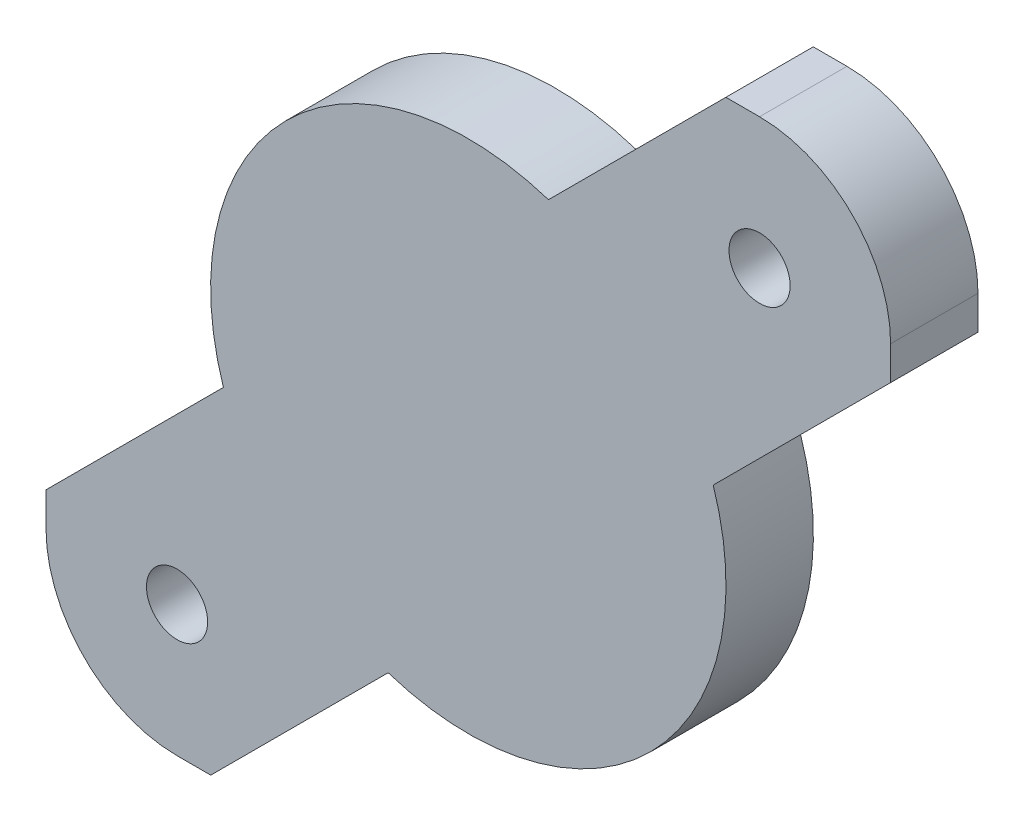
ISO-10303-21;
HEADER;
FILE_DESCRIPTION(('STEP AP214'),'2;1');
FILE_NAME('part.step','',(''),(''),'','','');
FILE_SCHEMA(('AUTOMOTIVE_DESIGN { 1 0 10303 214 1 1 1 1 }'));
ENDSEC;
DATA;
#1=APPLICATION_CONTEXT('core data for automotive mechanical design processes');
#2=APPLICATION_PROTOCOL_DEFINITION('international standard','automotive_design',2000,#1);
#3=PRODUCT_CONTEXT('',#1,'mechanical');
#4=PRODUCT('Part','Part','',(#3));
#5=PRODUCT_RELATED_PRODUCT_CATEGORY('part','',(#4));
#6=PRODUCT_DEFINITION_FORMATION('','',#4);
#7=PRODUCT_DEFINITION_CONTEXT('part definition',#1,'design');
#8=PRODUCT_DEFINITION('design','',#6,#7);
#9=PRODUCT_DEFINITION_SHAPE('','',#8);
#10=(LENGTH_UNIT() NAMED_UNIT(*) SI_UNIT(.MILLI.,.METRE.));
#11=(NAMED_UNIT(*) PLANE_ANGLE_UNIT() SI_UNIT($,.RADIAN.));
#12=(NAMED_UNIT(*) SI_UNIT($,.STERADIAN.) SOLID_ANGLE_UNIT());
#13=UNCERTAINTY_MEASURE_WITH_UNIT(LENGTH_MEASURE(1.E-05),#10,'distance_accuracy_value','');
#14=(GEOMETRIC_REPRESENTATION_CONTEXT(3) GLOBAL_UNCERTAINTY_ASSIGNED_CONTEXT((#13)) GLOBAL_UNIT_ASSIGNED_CONTEXT((#10,
#11,#12)) REPRESENTATION_CONTEXT('',''));
#15=CARTESIAN_POINT('',(0.,0.,0.));
#16=DIRECTION('',(0.,0.,1.));
#17=DIRECTION('',(1.,0.,0.));
#18=AXIS2_PLACEMENT_3D('',#15,#16,#17);
#19=CARTESIAN_POINT('',(0.,0.,3.));
#20=DIRECTION('',(0.,0.,1.));
#21=DIRECTION('',(1.,0.,0.));
#22=AXIS2_PLACEMENT_3D('',#19,#20,#21);
#23=PLANE('',#22);
#24=CARTESIAN_POINT('',(10.,10.,3.));
#25=DIRECTION('',(0.,0.,1.));
#26=DIRECTION('',(1.,0.,0.));
#27=AXIS2_PLACEMENT_3D('',#24,#25,#26);
#28=CIRCLE('',#27,1.05);
#29=CARTESIAN_POINT('',(11.05,10.,3.));
#30=VERTEX_POINT('',#29);
#31=EDGE_CURVE('E158',#30,#30,#28,.T.);
#32=ORIENTED_EDGE('',*,*,#31,.F.);
#33=EDGE_LOOP('',(#32));
#34=FACE_BOUND('',#33,.T.);
#35=CARTESIAN_POINT('',(0.,0.,3.));
#36=DIRECTION('',(0.,0.,1.));
#37=DIRECTION('',(1.,0.,0.));
#38=AXIS2_PLACEMENT_3D('',#35,#36,#37);
#39=CIRCLE('',#38,8.84830328308138);
#40=CARTESIAN_POINT('',(2.7524541223952,8.40930837188757,3.));
#41=VERTEX_POINT('',#40);
#42=CARTESIAN_POINT('',(-8.40930837188758,-2.75245412239519,3.));
#43=VERTEX_POINT('',#42);
#44=EDGE_CURVE('E177',#41,#43,#39,.T.);
#45=ORIENTED_EDGE('',*,*,#44,.T.);
#46=DIRECTION('',(-0.707106781186541,-0.707106781186554,0.));
#47=VECTOR('',#46,1.);
#48=CARTESIAN_POINT('',(-8.40930837188758,-2.75245412239519,3.));
#49=LINE('',#48,#47);
#50=CARTESIAN_POINT('',(-14.5,-8.84314575050771,3.));
#51=VERTEX_POINT('',#50);
#52=EDGE_CURVE('E105',#43,#51,#49,.T.);
#53=ORIENTED_EDGE('',*,*,#52,.T.);
#54=DIRECTION('',(0.,-1.,0.));
#55=VECTOR('',#54,1.);
#56=CARTESIAN_POINT('',(-14.5,-10.,3.));
#57=LINE('',#56,#55);
#58=CARTESIAN_POINT('',(-14.5,-10.,3.));
#59=VERTEX_POINT('',#58);
#60=EDGE_CURVE('E204',#51,#59,#57,.T.);
#61=ORIENTED_EDGE('',*,*,#60,.T.);
#62=CARTESIAN_POINT('',(-9.99999999999999,-10.,3.));
#63=DIRECTION('',(0.,0.,1.));
#64=DIRECTION('',(1.,0.,0.));
#65=AXIS2_PLACEMENT_3D('',#62,#63,#64);
#66=CIRCLE('',#65,4.5);
#67=CARTESIAN_POINT('',(-9.99999999999999,-14.5,3.));
#68=VERTEX_POINT('',#67);
#69=EDGE_CURVE('E223',#59,#68,#66,.T.);
#70=ORIENTED_EDGE('',*,*,#69,.T.);
#71=DIRECTION('',(1.,0.,0.));
#72=VECTOR('',#71,1.);
#73=CARTESIAN_POINT('',(-9.99999999999999,-14.5,3.));
#74=LINE('',#73,#72);
#75=CARTESIAN_POINT('',(-8.84314575050751,-14.5,3.));
#76=VERTEX_POINT('',#75);
#77=EDGE_CURVE('E220',#68,#76,#74,.T.);
#78=ORIENTED_EDGE('',*,*,#77,.T.);
#79=DIRECTION('',(0.707106781186541,0.707106781186554,0.));
#80=VECTOR('',#79,1.);
#81=CARTESIAN_POINT('',(-2.75245412239519,-8.40930837188757,3.));
#82=LINE('',#81,#80);
#83=CARTESIAN_POINT('',(-2.75245412239519,-8.40930837188757,3.));
#84=VERTEX_POINT('',#83);
#85=EDGE_CURVE('E222',#76,#84,#82,.T.);
#86=ORIENTED_EDGE('',*,*,#85,.T.);
#87=CARTESIAN_POINT('',(0.,0.,3.));
#88=DIRECTION('',(0.,0.,1.));
#89=DIRECTION('',(1.,0.,0.));
#90=AXIS2_PLACEMENT_3D('',#87,#88,#89);
#91=CIRCLE('',#90,8.84830328308138);
#92=CARTESIAN_POINT('',(8.40930837188758,2.75245412239519,3.));
#93=VERTEX_POINT('',#92);
#94=EDGE_CURVE('E225',#84,#93,#91,.T.);
#95=ORIENTED_EDGE('',*,*,#94,.T.);
#96=DIRECTION('',(0.707106781186546,0.707106781186549,0.));
#97=VECTOR('',#96,1.);
#98=CARTESIAN_POINT('',(8.40930837188758,2.75245412239519,3.));
#99=LINE('',#98,#97);
#100=CARTESIAN_POINT('',(14.5,8.84314575050764,3.));
#101=VERTEX_POINT('',#100);
#102=EDGE_CURVE('E231',#93,#101,#99,.T.);
#103=ORIENTED_EDGE('',*,*,#102,.T.);
#104=DIRECTION('',(0.,1.,0.));
#105=VECTOR('',#104,1.);
#106=CARTESIAN_POINT('',(14.5,10.,3.));
#107=LINE('',#106,#105);
#108=CARTESIAN_POINT('',(14.5,10.,3.));
#109=VERTEX_POINT('',#108);
#110=EDGE_CURVE('E136',#101,#109,#107,.T.);
#111=ORIENTED_EDGE('',*,*,#110,.T.);
#112=CARTESIAN_POINT('',(10.,10.,3.));
#113=DIRECTION('',(0.,0.,1.));
#114=DIRECTION('',(1.,0.,0.));
#115=AXIS2_PLACEMENT_3D('',#112,#113,#114);
#116=CIRCLE('',#115,4.5);
#117=CARTESIAN_POINT('',(10.,14.5,3.));
#118=VERTEX_POINT('',#117);
#119=EDGE_CURVE('E130',#109,#118,#116,.T.);
#120=ORIENTED_EDGE('',*,*,#119,.T.);
#121=DIRECTION('',(-1.,0.,0.));
#122=VECTOR('',#121,1.);
#123=CARTESIAN_POINT('',(8.84314575050761,14.5,3.));
#124=LINE('',#123,#122);
#125=CARTESIAN_POINT('',(8.84314575050761,14.5,3.));
#126=VERTEX_POINT('',#125);
#127=EDGE_CURVE('E134',#118,#126,#124,.T.);
#128=ORIENTED_EDGE('',*,*,#127,.T.);
#129=DIRECTION('',(-0.707106781186546,-0.707106781186549,0.));
#130=VECTOR('',#129,1.);
#131=CARTESIAN_POINT('',(2.7524541223952,8.40930837188757,3.));
#132=LINE('',#131,#130);
#133=EDGE_CURVE('E50',#126,#41,#132,.T.);
#134=ORIENTED_EDGE('',*,*,#133,.T.);
#135=EDGE_LOOP('',(#45,#53,#61,#70,#78,#86,#95,#103,#111,#120,#128,#134));
#136=FACE_BOUND('',#135,.T.);
#137=CARTESIAN_POINT('',(-10.,-10.,3.));
#138=DIRECTION('',(0.,0.,1.));
#139=DIRECTION('',(1.,0.,0.));
#140=AXIS2_PLACEMENT_3D('',#137,#138,#139);
#141=CIRCLE('',#140,1.05);
#142=CARTESIAN_POINT('',(-8.95,-10.,3.));
#143=VERTEX_POINT('',#142);
#144=EDGE_CURVE('E273',#143,#143,#141,.T.);
#145=ORIENTED_EDGE('',*,*,#144,.F.);
#146=EDGE_LOOP('',(#145));
#147=FACE_BOUND('',#146,.T.);
#148=ADVANCED_FACE('F33',(#34,#136,#147),#23,.T.);
#149=CARTESIAN_POINT('',(0.,0.,0.));
#150=DIRECTION('',(0.,0.,1.));
#151=DIRECTION('',(1.,0.,0.));
#152=AXIS2_PLACEMENT_3D('',#149,#150,#151);
#153=PLANE('',#152);
#154=CARTESIAN_POINT('',(0.,0.,0.));
#155=DIRECTION('',(0.,0.,1.));
#156=DIRECTION('',(1.,0.,0.));
#157=AXIS2_PLACEMENT_3D('',#154,#155,#156);
#158=CIRCLE('',#157,8.84830328308138);
#159=CARTESIAN_POINT('',(2.7524541223952,8.40930837188757,0.));
#160=VERTEX_POINT('',#159);
#161=CARTESIAN_POINT('',(-8.40930837188758,-2.75245412239519,0.));
#162=VERTEX_POINT('',#161);
#163=EDGE_CURVE('E154',#160,#162,#158,.T.);
#164=ORIENTED_EDGE('',*,*,#163,.F.);
#165=DIRECTION('',(-0.707106781186546,-0.707106781186549,0.));
#166=VECTOR('',#165,1.);
#167=CARTESIAN_POINT('',(2.7524541223952,8.40930837188757,0.));
#168=LINE('',#167,#166);
#169=CARTESIAN_POINT('',(8.84314575050761,14.5,0.));
#170=VERTEX_POINT('',#169);
#171=EDGE_CURVE('E97',#170,#160,#168,.T.);
#172=ORIENTED_EDGE('',*,*,#171,.F.);
#173=DIRECTION('',(-1.,0.,0.));
#174=VECTOR('',#173,1.);
#175=CARTESIAN_POINT('',(8.84314575050761,14.5,0.));
#176=LINE('',#175,#174);
#177=CARTESIAN_POINT('',(10.,14.5,0.));
#178=VERTEX_POINT('',#177);
#179=EDGE_CURVE('E91',#178,#170,#176,.T.);
#180=ORIENTED_EDGE('',*,*,#179,.F.);
#181=CARTESIAN_POINT('',(10.,10.,0.));
#182=DIRECTION('',(0.,0.,1.));
#183=DIRECTION('',(1.,0.,0.));
#184=AXIS2_PLACEMENT_3D('',#181,#182,#183);
#185=CIRCLE('',#184,4.5);
#186=CARTESIAN_POINT('',(14.5,10.,0.));
#187=VERTEX_POINT('',#186);
#188=EDGE_CURVE('E144',#187,#178,#185,.T.);
#189=ORIENTED_EDGE('',*,*,#188,.F.);
#190=DIRECTION('',(0.,1.,0.));
#191=VECTOR('',#190,1.);
#192=CARTESIAN_POINT('',(14.5,10.,0.));
#193=LINE('',#192,#191);
#194=CARTESIAN_POINT('',(14.5,8.84314575050764,0.));
#195=VERTEX_POINT('',#194);
#196=EDGE_CURVE('E172',#195,#187,#193,.T.);
#197=ORIENTED_EDGE('',*,*,#196,.F.);
#198=DIRECTION('',(0.707106781186546,0.707106781186549,0.));
#199=VECTOR('',#198,1.);
#200=CARTESIAN_POINT('',(8.40930837188758,2.75245412239519,0.));
#201=LINE('',#200,#199);
#202=CARTESIAN_POINT('',(8.40930837188758,2.75245412239519,0.));
#203=VERTEX_POINT('',#202);
#204=EDGE_CURVE('E170',#203,#195,#201,.T.);
#205=ORIENTED_EDGE('',*,*,#204,.F.);
#206=CARTESIAN_POINT('',(0.,0.,0.));
#207=DIRECTION('',(0.,0.,1.));
#208=DIRECTION('',(1.,0.,0.));
#209=AXIS2_PLACEMENT_3D('',#206,#207,#208);
#210=CIRCLE('',#209,8.84830328308138);
#211=CARTESIAN_POINT('',(-2.75245412239519,-8.40930837188757,0.));
#212=VERTEX_POINT('',#211);
#213=EDGE_CURVE('E168',#212,#203,#210,.T.);
#214=ORIENTED_EDGE('',*,*,#213,.F.);
#215=DIRECTION('',(0.707106781186541,0.707106781186554,0.));
#216=VECTOR('',#215,1.);
#217=CARTESIAN_POINT('',(-2.75245412239519,-8.40930837188757,0.));
#218=LINE('',#217,#216);
#219=CARTESIAN_POINT('',(-8.84314575050751,-14.5,0.));
#220=VERTEX_POINT('',#219);
#221=EDGE_CURVE('E166',#220,#212,#218,.T.);
#222=ORIENTED_EDGE('',*,*,#221,.F.);
#223=DIRECTION('',(1.,0.,0.));
#224=VECTOR('',#223,1.);
#225=CARTESIAN_POINT('',(-9.99999999999999,-14.5,0.));
#226=LINE('',#225,#224);
#227=CARTESIAN_POINT('',(-9.99999999999999,-14.5,0.));
#228=VERTEX_POINT('',#227);
#229=EDGE_CURVE('E164',#228,#220,#226,.T.);
#230=ORIENTED_EDGE('',*,*,#229,.F.);
#231=CARTESIAN_POINT('',(-9.99999999999999,-10.,0.));
#232=DIRECTION('',(0.,0.,1.));
#233=DIRECTION('',(1.,0.,0.));
#234=AXIS2_PLACEMENT_3D('',#231,#232,#233);
#235=CIRCLE('',#234,4.5);
#236=CARTESIAN_POINT('',(-14.5,-10.,0.));
#237=VERTEX_POINT('',#236);
#238=EDGE_CURVE('E162',#237,#228,#235,.T.);
#239=ORIENTED_EDGE('',*,*,#238,.F.);
#240=DIRECTION('',(0.,-1.,0.));
#241=VECTOR('',#240,1.);
#242=CARTESIAN_POINT('',(-14.5,-10.,0.));
#243=LINE('',#242,#241);
#244=CARTESIAN_POINT('',(-14.5,-8.84314575050771,0.));
#245=VERTEX_POINT('',#244);
#246=EDGE_CURVE('E160',#245,#237,#243,.T.);
#247=ORIENTED_EDGE('',*,*,#246,.F.);
#248=DIRECTION('',(-0.707106781186541,-0.707106781186554,0.));
#249=VECTOR('',#248,1.);
#250=CARTESIAN_POINT('',(-8.40930837188758,-2.75245412239519,0.));
#251=LINE('',#250,#249);
#252=EDGE_CURVE('E157',#162,#245,#251,.T.);
#253=ORIENTED_EDGE('',*,*,#252,.F.);
#254=EDGE_LOOP('',(#164,#172,#180,#189,#197,#205,#214,#222,#230,#239,#247,#253));
#255=FACE_BOUND('',#254,.T.);
#256=CARTESIAN_POINT('',(10.,10.,0.));
#257=DIRECTION('',(0.,0.,1.));
#258=DIRECTION('',(1.,0.,0.));
#259=AXIS2_PLACEMENT_3D('',#256,#257,#258);
#260=CIRCLE('',#259,1.05);
#261=CARTESIAN_POINT('',(11.05,10.,0.));
#262=VERTEX_POINT('',#261);
#263=EDGE_CURVE('E279',#262,#262,#260,.T.);
#264=ORIENTED_EDGE('',*,*,#263,.T.);
#265=EDGE_LOOP('',(#264));
#266=FACE_BOUND('',#265,.T.);
#267=CARTESIAN_POINT('',(-10.,-10.,0.));
#268=DIRECTION('',(0.,0.,1.));
#269=DIRECTION('',(1.,0.,0.));
#270=AXIS2_PLACEMENT_3D('',#267,#268,#269);
#271=CIRCLE('',#270,1.05);
#272=CARTESIAN_POINT('',(-8.95,-10.,0.));
#273=VERTEX_POINT('',#272);
#274=EDGE_CURVE('E276',#273,#273,#271,.T.);
#275=ORIENTED_EDGE('',*,*,#274,.T.);
#276=EDGE_LOOP('',(#275));
#277=FACE_BOUND('',#276,.T.);
#278=ADVANCED_FACE('F208',(#255,#266,#277),#153,.F.);
#279=CARTESIAN_POINT('',(0.,0.,3.));
#280=DIRECTION('',(0.,0.,-1.));
#281=DIRECTION('',(-1.,0.,0.));
#282=AXIS2_PLACEMENT_3D('',#279,#280,#281);
#283=CYLINDRICAL_SURFACE('',#282,8.84830328308138);
#284=ORIENTED_EDGE('',*,*,#163,.T.);
#285=DIRECTION('',(0.,0.,-1.));
#286=VECTOR('',#285,1.);
#287=CARTESIAN_POINT('',(-8.40930837188758,-2.75245412239519,3.));
#288=LINE('',#287,#286);
#289=EDGE_CURVE('E11',#43,#162,#288,.T.);
#290=ORIENTED_EDGE('',*,*,#289,.F.);
#291=ORIENTED_EDGE('',*,*,#44,.F.);
#292=DIRECTION('',(0.,0.,-1.));
#293=VECTOR('',#292,1.);
#294=CARTESIAN_POINT('',(2.7524541223952,8.40930837188757,3.));
#295=LINE('',#294,#293);
#296=EDGE_CURVE('E150',#41,#160,#295,.T.);
#297=ORIENTED_EDGE('',*,*,#296,.T.);
#298=EDGE_LOOP('',(#284,#290,#291,#297));
#299=FACE_BOUND('',#298,.T.);
#300=ADVANCED_FACE('F35',(#299),#283,.T.);
#301=CARTESIAN_POINT('',(-8.40930837188758,-2.75245412239519,3.));
#302=DIRECTION('',(0.707106781186554,-0.707106781186541,0.));
#303=DIRECTION('',(0.707106781186541,0.707106781186554,0.));
#304=AXIS2_PLACEMENT_3D('',#301,#302,#303);
#305=PLANE('',#304);
#306=ORIENTED_EDGE('',*,*,#252,.T.);
#307=DIRECTION('',(0.,0.,-1.));
#308=VECTOR('',#307,1.);
#309=CARTESIAN_POINT('',(-14.5,-8.84314575050771,3.));
#310=LINE('',#309,#308);
#311=EDGE_CURVE('E42',#51,#245,#310,.T.);
#312=ORIENTED_EDGE('',*,*,#311,.F.);
#313=ORIENTED_EDGE('',*,*,#52,.F.);
#314=ORIENTED_EDGE('',*,*,#289,.T.);
#315=EDGE_LOOP('',(#306,#312,#313,#314));
#316=FACE_BOUND('',#315,.T.);
#317=ADVANCED_FACE('F372',(#316),#305,.F.);
#318=CARTESIAN_POINT('',(-14.5,-10.,3.));
#319=DIRECTION('',(1.,0.,0.));
#320=DIRECTION('',(0.,1.,0.));
#321=AXIS2_PLACEMENT_3D('',#318,#319,#320);
#322=PLANE('',#321);
#323=ORIENTED_EDGE('',*,*,#246,.T.);
#324=DIRECTION('',(0.,0.,-1.));
#325=VECTOR('',#324,1.);
#326=CARTESIAN_POINT('',(-14.5,-10.,3.));
#327=LINE('',#326,#325);
#328=EDGE_CURVE('E196',#59,#237,#327,.T.);
#329=ORIENTED_EDGE('',*,*,#328,.F.);
#330=ORIENTED_EDGE('',*,*,#60,.F.);
#331=ORIENTED_EDGE('',*,*,#311,.T.);
#332=EDGE_LOOP('',(#323,#329,#330,#331));
#333=FACE_BOUND('',#332,.T.);
#334=ADVANCED_FACE('F202',(#333),#322,.F.);
#335=CARTESIAN_POINT('',(-9.99999999999999,-10.,3.));
#336=DIRECTION('',(0.,0.,-1.));
#337=DIRECTION('',(-1.,0.,0.));
#338=AXIS2_PLACEMENT_3D('',#335,#336,#337);
#339=CYLINDRICAL_SURFACE('',#338,4.5);
#340=ORIENTED_EDGE('',*,*,#238,.T.);
#341=DIRECTION('',(0.,0.,-1.));
#342=VECTOR('',#341,1.);
#343=CARTESIAN_POINT('',(-9.99999999999999,-14.5,3.));
#344=LINE('',#343,#342);
#345=EDGE_CURVE('E193',#68,#228,#344,.T.);
#346=ORIENTED_EDGE('',*,*,#345,.F.);
#347=ORIENTED_EDGE('',*,*,#69,.F.);
#348=ORIENTED_EDGE('',*,*,#328,.T.);
#349=EDGE_LOOP('',(#340,#346,#347,#348));
#350=FACE_BOUND('',#349,.T.);
#351=ADVANCED_FACE('F214',(#350),#339,.T.);
#352=CARTESIAN_POINT('',(-9.99999999999999,-14.5,3.));
#353=DIRECTION('',(0.,1.,0.));
#354=DIRECTION('',(-1.,0.,0.));
#355=AXIS2_PLACEMENT_3D('',#352,#353,#354);
#356=PLANE('',#355);
#357=ORIENTED_EDGE('',*,*,#229,.T.);
#358=DIRECTION('',(0.,0.,-1.));
#359=VECTOR('',#358,1.);
#360=CARTESIAN_POINT('',(-8.84314575050751,-14.5,3.));
#361=LINE('',#360,#359);
#362=EDGE_CURVE('E190',#76,#220,#361,.T.);
#363=ORIENTED_EDGE('',*,*,#362,.F.);
#364=ORIENTED_EDGE('',*,*,#77,.F.);
#365=ORIENTED_EDGE('',*,*,#345,.T.);
#366=EDGE_LOOP('',(#357,#363,#364,#365));
#367=FACE_BOUND('',#366,.T.);
#368=ADVANCED_FACE('F218',(#367),#356,.F.);
#369=CARTESIAN_POINT('',(-2.75245412239519,-8.40930837188757,3.));
#370=DIRECTION('',(-0.707106781186554,0.707106781186541,0.));
#371=DIRECTION('',(-0.707106781186541,-0.707106781186554,0.));
#372=AXIS2_PLACEMENT_3D('',#369,#370,#371);
#373=PLANE('',#372);
#374=ORIENTED_EDGE('',*,*,#221,.T.);
#375=DIRECTION('',(0.,0.,-1.));
#376=VECTOR('',#375,1.);
#377=CARTESIAN_POINT('',(-2.75245412239519,-8.40930837188757,3.));
#378=LINE('',#377,#376);
#379=EDGE_CURVE('E187',#84,#212,#378,.T.);
#380=ORIENTED_EDGE('',*,*,#379,.F.);
#381=ORIENTED_EDGE('',*,*,#85,.F.);
#382=ORIENTED_EDGE('',*,*,#362,.T.);
#383=EDGE_LOOP('',(#374,#380,#381,#382));
#384=FACE_BOUND('',#383,.T.);
#385=ADVANCED_FACE('F337',(#384),#373,.F.);
#386=CARTESIAN_POINT('',(0.,0.,3.));
#387=DIRECTION('',(0.,0.,-1.));
#388=DIRECTION('',(-1.,0.,0.));
#389=AXIS2_PLACEMENT_3D('',#386,#387,#388);
#390=CYLINDRICAL_SURFACE('',#389,8.84830328308138);
#391=ORIENTED_EDGE('',*,*,#213,.T.);
#392=DIRECTION('',(0.,0.,-1.));
#393=VECTOR('',#392,1.);
#394=CARTESIAN_POINT('',(8.40930837188758,2.75245412239519,3.));
#395=LINE('',#394,#393);
#396=EDGE_CURVE('E184',#93,#203,#395,.T.);
#397=ORIENTED_EDGE('',*,*,#396,.F.);
#398=ORIENTED_EDGE('',*,*,#94,.F.);
#399=ORIENTED_EDGE('',*,*,#379,.T.);
#400=EDGE_LOOP('',(#391,#397,#398,#399));
#401=FACE_BOUND('',#400,.T.);
#402=ADVANCED_FACE('F328',(#401),#390,.T.);
#403=CARTESIAN_POINT('',(8.40930837188758,2.75245412239519,3.));
#404=DIRECTION('',(-0.707106781186549,0.707106781186546,0.));
#405=DIRECTION('',(-0.707106781186546,-0.707106781186549,0.));
#406=AXIS2_PLACEMENT_3D('',#403,#404,#405);
#407=PLANE('',#406);
#408=ORIENTED_EDGE('',*,*,#204,.T.);
#409=DIRECTION('',(0.,0.,-1.));
#410=VECTOR('',#409,1.);
#411=CARTESIAN_POINT('',(14.5,8.84314575050764,3.));
#412=LINE('',#411,#410);
#413=EDGE_CURVE('E181',#101,#195,#412,.T.);
#414=ORIENTED_EDGE('',*,*,#413,.F.);
#415=ORIENTED_EDGE('',*,*,#102,.F.);
#416=ORIENTED_EDGE('',*,*,#396,.T.);
#417=EDGE_LOOP('',(#408,#414,#415,#416));
#418=FACE_BOUND('',#417,.T.);
#419=ADVANCED_FACE('F237',(#418),#407,.F.);
#420=CARTESIAN_POINT('',(14.5,10.,3.));
#421=DIRECTION('',(-1.,0.,0.));
#422=DIRECTION('',(0.,-1.,0.));
#423=AXIS2_PLACEMENT_3D('',#420,#421,#422);
#424=PLANE('',#423);
#425=ORIENTED_EDGE('',*,*,#196,.T.);
#426=DIRECTION('',(0.,0.,-1.));
#427=VECTOR('',#426,1.);
#428=CARTESIAN_POINT('',(14.5,10.,3.));
#429=LINE('',#428,#427);
#430=EDGE_CURVE('E145',#109,#187,#429,.T.);
#431=ORIENTED_EDGE('',*,*,#430,.F.);
#432=ORIENTED_EDGE('',*,*,#110,.F.);
#433=ORIENTED_EDGE('',*,*,#413,.T.);
#434=EDGE_LOOP('',(#425,#431,#432,#433));
#435=FACE_BOUND('',#434,.T.);
#436=ADVANCED_FACE('F241',(#435),#424,.F.);
#437=CARTESIAN_POINT('',(10.,10.,3.));
#438=DIRECTION('',(0.,0.,-1.));
#439=DIRECTION('',(-1.,0.,0.));
#440=AXIS2_PLACEMENT_3D('',#437,#438,#439);
#441=CYLINDRICAL_SURFACE('',#440,4.5);
#442=ORIENTED_EDGE('',*,*,#188,.T.);
#443=DIRECTION('',(0.,0.,-1.));
#444=VECTOR('',#443,1.);
#445=CARTESIAN_POINT('',(10.,14.5,3.));
#446=LINE('',#445,#444);
#447=EDGE_CURVE('E141',#118,#178,#446,.T.);
#448=ORIENTED_EDGE('',*,*,#447,.F.);
#449=ORIENTED_EDGE('',*,*,#119,.F.);
#450=ORIENTED_EDGE('',*,*,#430,.T.);
#451=EDGE_LOOP('',(#442,#448,#449,#450));
#452=FACE_BOUND('',#451,.T.);
#453=ADVANCED_FACE('F142',(#452),#441,.T.);
#454=CARTESIAN_POINT('',(8.84314575050761,14.5,3.));
#455=DIRECTION('',(0.,-1.,0.));
#456=DIRECTION('',(1.,0.,0.));
#457=AXIS2_PLACEMENT_3D('',#454,#455,#456);
#458=PLANE('',#457);
#459=ORIENTED_EDGE('',*,*,#179,.T.);
#460=DIRECTION('',(0.,0.,-1.));
#461=VECTOR('',#460,1.);
#462=CARTESIAN_POINT('',(8.84314575050761,14.5,3.));
#463=LINE('',#462,#461);
#464=EDGE_CURVE('E146',#126,#170,#463,.T.);
#465=ORIENTED_EDGE('',*,*,#464,.F.);
#466=ORIENTED_EDGE('',*,*,#127,.F.);
#467=ORIENTED_EDGE('',*,*,#447,.T.);
#468=EDGE_LOOP('',(#459,#465,#466,#467));
#469=FACE_BOUND('',#468,.T.);
#470=ADVANCED_FACE('F148',(#469),#458,.F.);
#471=CARTESIAN_POINT('',(2.7524541223952,8.40930837188757,3.));
#472=DIRECTION('',(0.707106781186549,-0.707106781186546,0.));
#473=DIRECTION('',(0.707106781186546,0.707106781186549,0.));
#474=AXIS2_PLACEMENT_3D('',#471,#472,#473);
#475=PLANE('',#474);
#476=ORIENTED_EDGE('',*,*,#171,.T.);
#477=ORIENTED_EDGE('',*,*,#296,.F.);
#478=ORIENTED_EDGE('',*,*,#133,.F.);
#479=ORIENTED_EDGE('',*,*,#464,.T.);
#480=EDGE_LOOP('',(#476,#477,#478,#479));
#481=FACE_BOUND('',#480,.T.);
#482=ADVANCED_FACE('F245',(#481),#475,.F.);
#483=CARTESIAN_POINT('',(10.,10.,3.));
#484=DIRECTION('',(0.,0.,-1.));
#485=DIRECTION('',(-1.,0.,0.));
#486=AXIS2_PLACEMENT_3D('',#483,#484,#485);
#487=CYLINDRICAL_SURFACE('',#486,1.05);
#488=ORIENTED_EDGE('',*,*,#31,.T.);
#489=EDGE_LOOP('',(#488));
#490=FACE_BOUND('',#489,.T.);
#491=ORIENTED_EDGE('',*,*,#263,.F.);
#492=EDGE_LOOP('',(#491));
#493=FACE_BOUND('',#492,.T.);
#494=ADVANCED_FACE('F247',(#490,#493),#487,.F.);
#495=CARTESIAN_POINT('',(-10.,-10.,3.));
#496=DIRECTION('',(0.,0.,-1.));
#497=DIRECTION('',(-1.,0.,0.));
#498=AXIS2_PLACEMENT_3D('',#495,#496,#497);
#499=CYLINDRICAL_SURFACE('',#498,1.05);
#500=ORIENTED_EDGE('',*,*,#144,.T.);
#501=EDGE_LOOP('',(#500));
#502=FACE_BOUND('',#501,.T.);
#503=ORIENTED_EDGE('',*,*,#274,.F.);
#504=EDGE_LOOP('',(#503));
#505=FACE_BOUND('',#504,.T.);
#506=ADVANCED_FACE('F253',(#502,#505),#499,.F.);
#507=CLOSED_SHELL('',(#148,#278,#300,#317,#334,#351,#368,#385,#402,#419,#436,#453,#470,#482,
#494,#506));
#508=MANIFOLD_SOLID_BREP('B2',#507);
#509=ADVANCED_BREP_SHAPE_REPRESENTATION('',(#18,#508),#14);
#510=SHAPE_DEFINITION_REPRESENTATION(#9,#509);
ENDSEC;
END-ISO-10303-21;
